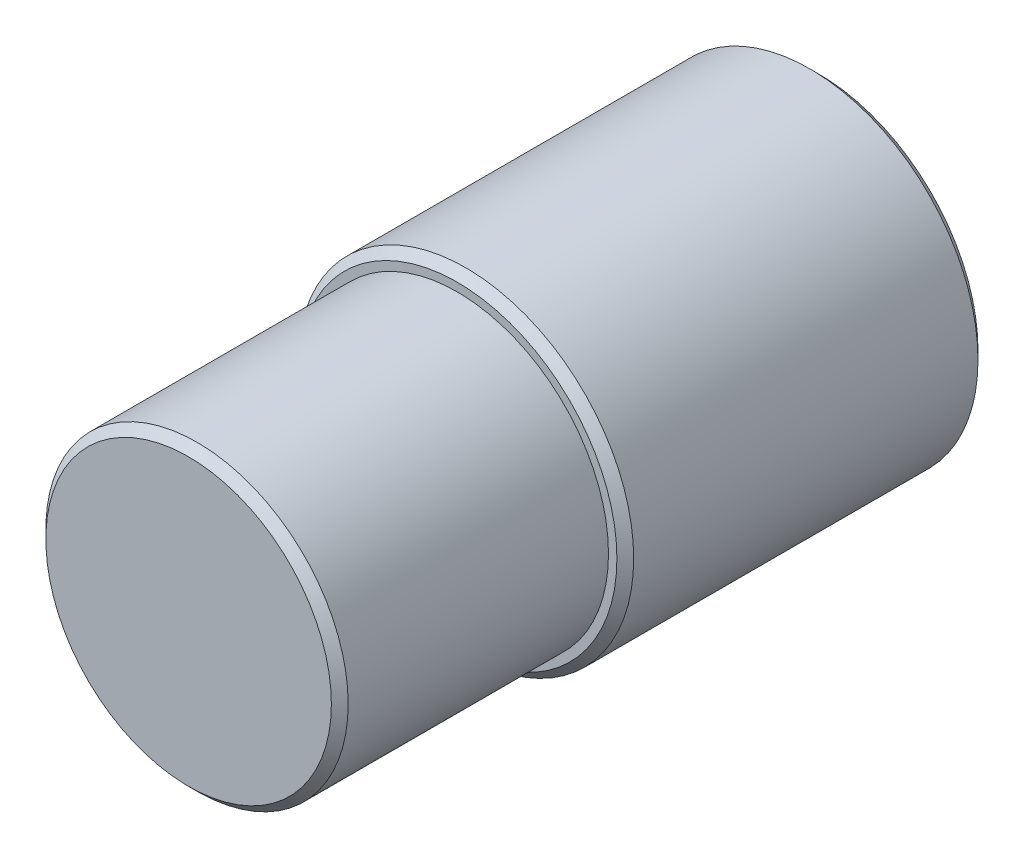
ISO-10303-21;
HEADER;
FILE_DESCRIPTION(('STEP AP214'),'2;1');
FILE_NAME('part.step','',(''),(''),'','','');
FILE_SCHEMA(('AUTOMOTIVE_DESIGN { 1 0 10303 214 1 1 1 1 }'));
ENDSEC;
DATA;
#1=APPLICATION_CONTEXT('core data for automotive mechanical design processes');
#2=APPLICATION_PROTOCOL_DEFINITION('international standard','automotive_design',2000,#1);
#3=PRODUCT_CONTEXT('',#1,'mechanical');
#4=PRODUCT('Part','Part','',(#3));
#5=PRODUCT_RELATED_PRODUCT_CATEGORY('part','',(#4));
#6=PRODUCT_DEFINITION_FORMATION('','',#4);
#7=PRODUCT_DEFINITION_CONTEXT('part definition',#1,'design');
#8=PRODUCT_DEFINITION('design','',#6,#7);
#9=PRODUCT_DEFINITION_SHAPE('','',#8);
#10=(LENGTH_UNIT() NAMED_UNIT(*) SI_UNIT(.MILLI.,.METRE.));
#11=(NAMED_UNIT(*) PLANE_ANGLE_UNIT() SI_UNIT($,.RADIAN.));
#12=(NAMED_UNIT(*) SI_UNIT($,.STERADIAN.) SOLID_ANGLE_UNIT());
#13=UNCERTAINTY_MEASURE_WITH_UNIT(LENGTH_MEASURE(1.E-05),#10,'distance_accuracy_value','');
#14=(GEOMETRIC_REPRESENTATION_CONTEXT(3) GLOBAL_UNCERTAINTY_ASSIGNED_CONTEXT((#13)) GLOBAL_UNIT_ASSIGNED_CONTEXT((#10,
#11,#12)) REPRESENTATION_CONTEXT('',''));
#15=CARTESIAN_POINT('',(0.,0.,0.));
#16=DIRECTION('',(0.,0.,1.));
#17=DIRECTION('',(1.,0.,0.));
#18=AXIS2_PLACEMENT_3D('',#15,#16,#17);
#19=CARTESIAN_POINT('',(0.,0.,21.5));
#20=DIRECTION('',(0.,0.,-1.));
#21=DIRECTION('',(-1.,0.,0.));
#22=AXIS2_PLACEMENT_3D('',#19,#20,#21);
#23=CYLINDRICAL_SURFACE('',#22,10.);
#24=CARTESIAN_POINT('',(0.,0.,0.5));
#25=DIRECTION('',(0.,0.,1.));
#26=DIRECTION('',(1.,0.,0.));
#27=AXIS2_PLACEMENT_3D('',#24,#25,#26);
#28=CIRCLE('',#27,10.);
#29=CARTESIAN_POINT('',(10.,0.,0.5));
#30=VERTEX_POINT('',#29);
#31=EDGE_CURVE('E70',#30,#30,#28,.T.);
#32=ORIENTED_EDGE('',*,*,#31,.T.);
#33=EDGE_LOOP('',(#32));
#34=FACE_BOUND('',#33,.T.);
#35=CARTESIAN_POINT('',(0.,0.,21.));
#36=DIRECTION('',(0.,0.,1.));
#37=DIRECTION('',(1.,0.,0.));
#38=AXIS2_PLACEMENT_3D('',#35,#36,#37);
#39=CIRCLE('',#38,10.);
#40=CARTESIAN_POINT('',(10.,0.,21.));
#41=VERTEX_POINT('',#40);
#42=EDGE_CURVE('E74',#41,#41,#39,.F.);
#43=ORIENTED_EDGE('',*,*,#42,.T.);
#44=EDGE_LOOP('',(#43));
#45=FACE_BOUND('',#44,.T.);
#46=ADVANCED_FACE('F45',(#34,#45),#23,.T.);
#47=CARTESIAN_POINT('',(0.,0.,21.5));
#48=DIRECTION('',(0.,0.,1.));
#49=DIRECTION('',(1.,0.,0.));
#50=AXIS2_PLACEMENT_3D('',#47,#48,#49);
#51=PLANE('',#50);
#52=CARTESIAN_POINT('',(0.,0.,21.5));
#53=DIRECTION('',(0.,0.,1.));
#54=DIRECTION('',(1.,0.,0.));
#55=AXIS2_PLACEMENT_3D('',#52,#53,#54);
#56=CIRCLE('',#55,9.5);
#57=CARTESIAN_POINT('',(9.5,0.,21.5));
#58=VERTEX_POINT('',#57);
#59=EDGE_CURVE('E59',#58,#58,#56,.T.);
#60=ORIENTED_EDGE('',*,*,#59,.T.);
#61=EDGE_LOOP('',(#60));
#62=FACE_BOUND('',#61,.T.);
#63=CARTESIAN_POINT('',(0.,0.,21.5));
#64=DIRECTION('',(0.,0.,1.));
#65=DIRECTION('',(1.,0.,0.));
#66=AXIS2_PLACEMENT_3D('',#63,#64,#65);
#67=CIRCLE('',#66,9.);
#68=CARTESIAN_POINT('',(9.,0.,21.5));
#69=VERTEX_POINT('',#68);
#70=EDGE_CURVE('E78',#69,#69,#67,.T.);
#71=ORIENTED_EDGE('',*,*,#70,.F.);
#72=EDGE_LOOP('',(#71));
#73=FACE_BOUND('',#72,.T.);
#74=ADVANCED_FACE('F85',(#62,#73),#51,.T.);
#75=CARTESIAN_POINT('',(0.,0.,0.));
#76=DIRECTION('',(0.,0.,1.));
#77=DIRECTION('',(1.,0.,0.));
#78=AXIS2_PLACEMENT_3D('',#75,#76,#77);
#79=PLANE('',#78);
#80=CARTESIAN_POINT('',(0.,0.,0.));
#81=DIRECTION('',(0.,0.,1.));
#82=DIRECTION('',(1.,0.,0.));
#83=AXIS2_PLACEMENT_3D('',#80,#81,#82);
#84=CIRCLE('',#83,9.49999999999999);
#85=CARTESIAN_POINT('',(9.49999999999999,0.,0.));
#86=VERTEX_POINT('',#85);
#87=EDGE_CURVE('E64',#86,#86,#84,.F.);
#88=ORIENTED_EDGE('',*,*,#87,.T.);
#89=EDGE_LOOP('',(#88));
#90=FACE_BOUND('',#89,.T.);
#91=ADVANCED_FACE('F87',(#90),#79,.F.);
#92=CARTESIAN_POINT('',(0.,0.,37.5));
#93=DIRECTION('',(0.,0.,-1.));
#94=DIRECTION('',(-1.,0.,0.));
#95=AXIS2_PLACEMENT_3D('',#92,#93,#94);
#96=CYLINDRICAL_SURFACE('',#95,9.);
#97=CARTESIAN_POINT('',(0.,0.,37.));
#98=DIRECTION('',(0.,0.,1.));
#99=DIRECTION('',(1.,0.,0.));
#100=AXIS2_PLACEMENT_3D('',#97,#98,#99);
#101=CIRCLE('',#100,9.);
#102=CARTESIAN_POINT('',(9.,0.,37.));
#103=VERTEX_POINT('',#102);
#104=EDGE_CURVE('E10',#103,#103,#101,.F.);
#105=ORIENTED_EDGE('',*,*,#104,.T.);
#106=EDGE_LOOP('',(#105));
#107=FACE_BOUND('',#106,.T.);
#108=ORIENTED_EDGE('',*,*,#70,.T.);
#109=EDGE_LOOP('',(#108));
#110=FACE_BOUND('',#109,.T.);
#111=ADVANCED_FACE('F83',(#107,#110),#96,.T.);
#112=CARTESIAN_POINT('',(0.,0.,37.5));
#113=DIRECTION('',(0.,0.,1.));
#114=DIRECTION('',(1.,0.,0.));
#115=AXIS2_PLACEMENT_3D('',#112,#113,#114);
#116=PLANE('',#115);
#117=CARTESIAN_POINT('',(0.,0.,37.5));
#118=DIRECTION('',(0.,0.,1.));
#119=DIRECTION('',(1.,0.,0.));
#120=AXIS2_PLACEMENT_3D('',#117,#118,#119);
#121=CIRCLE('',#120,8.49999999999999);
#122=CARTESIAN_POINT('',(8.49999999999999,0.,37.5));
#123=VERTEX_POINT('',#122);
#124=EDGE_CURVE('E54',#123,#123,#121,.T.);
#125=ORIENTED_EDGE('',*,*,#124,.T.);
#126=EDGE_LOOP('',(#125));
#127=FACE_BOUND('',#126,.T.);
#128=ADVANCED_FACE('F108',(#127),#116,.T.);
#129=CARTESIAN_POINT('',(0.,0.,0.5));
#130=DIRECTION('',(0.,0.,1.));
#131=DIRECTION('',(1.,0.,0.));
#132=AXIS2_PLACEMENT_3D('',#129,#130,#131);
#133=CONICAL_SURFACE('',#132,10.,0.785398163397454);
#134=ORIENTED_EDGE('',*,*,#87,.F.);
#135=EDGE_LOOP('',(#134));
#136=FACE_BOUND('',#135,.T.);
#137=ORIENTED_EDGE('',*,*,#31,.F.);
#138=EDGE_LOOP('',(#137));
#139=FACE_BOUND('',#138,.T.);
#140=ADVANCED_FACE('F102',(#136,#139),#133,.T.);
#141=CARTESIAN_POINT('',(0.,0.,21.5));
#142=DIRECTION('',(0.,0.,-1.));
#143=DIRECTION('',(-1.,0.,0.));
#144=AXIS2_PLACEMENT_3D('',#141,#142,#143);
#145=CONICAL_SURFACE('',#144,9.5,0.785398163397447);
#146=ORIENTED_EDGE('',*,*,#42,.F.);
#147=EDGE_LOOP('',(#146));
#148=FACE_BOUND('',#147,.T.);
#149=ORIENTED_EDGE('',*,*,#59,.F.);
#150=EDGE_LOOP('',(#149));
#151=FACE_BOUND('',#150,.T.);
#152=ADVANCED_FACE('F107',(#148,#151),#145,.T.);
#153=CARTESIAN_POINT('',(0.,0.,37.5));
#154=DIRECTION('',(0.,0.,-1.));
#155=DIRECTION('',(-1.,0.,0.));
#156=AXIS2_PLACEMENT_3D('',#153,#154,#155);
#157=CONICAL_SURFACE('',#156,8.49999999999999,0.785398163397454);
#158=ORIENTED_EDGE('',*,*,#104,.F.);
#159=EDGE_LOOP('',(#158));
#160=FACE_BOUND('',#159,.T.);
#161=ORIENTED_EDGE('',*,*,#124,.F.);
#162=EDGE_LOOP('',(#161));
#163=FACE_BOUND('',#162,.T.);
#164=ADVANCED_FACE('F48',(#160,#163),#157,.T.);
#165=CLOSED_SHELL('',(#46,#74,#91,#111,#128,#140,#152,#164));
#166=MANIFOLD_SOLID_BREP('B2',#165);
#167=ADVANCED_BREP_SHAPE_REPRESENTATION('',(#18,#166),#14);
#168=SHAPE_DEFINITION_REPRESENTATION(#9,#167);
ENDSEC;
END-ISO-10303-21;
